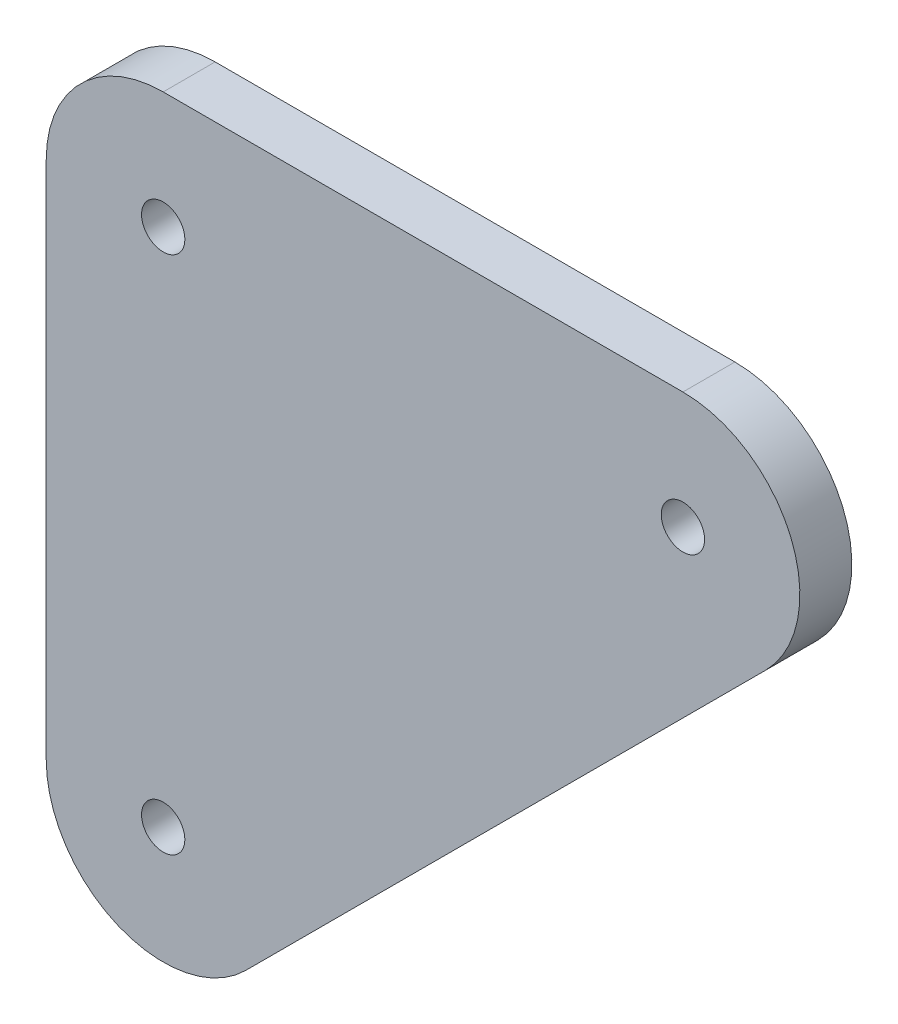
ISO-10303-21;
HEADER;
FILE_DESCRIPTION(('STEP AP214'),'2;1');
FILE_NAME('part.step','',(''),(''),'','','');
FILE_SCHEMA(('AUTOMOTIVE_DESIGN { 1 0 10303 214 1 1 1 1 }'));
ENDSEC;
DATA;
#1=APPLICATION_CONTEXT('core data for automotive mechanical design processes');
#2=APPLICATION_PROTOCOL_DEFINITION('international standard','automotive_design',2000,#1);
#3=PRODUCT_CONTEXT('',#1,'mechanical');
#4=PRODUCT('Part','Part','',(#3));
#5=PRODUCT_RELATED_PRODUCT_CATEGORY('part','',(#4));
#6=PRODUCT_DEFINITION_FORMATION('','',#4);
#7=PRODUCT_DEFINITION_CONTEXT('part definition',#1,'design');
#8=PRODUCT_DEFINITION('design','',#6,#7);
#9=PRODUCT_DEFINITION_SHAPE('','',#8);
#10=(LENGTH_UNIT() NAMED_UNIT(*) SI_UNIT(.MILLI.,.METRE.));
#11=(NAMED_UNIT(*) PLANE_ANGLE_UNIT() SI_UNIT($,.RADIAN.));
#12=(NAMED_UNIT(*) SI_UNIT($,.STERADIAN.) SOLID_ANGLE_UNIT());
#13=UNCERTAINTY_MEASURE_WITH_UNIT(LENGTH_MEASURE(1.E-05),#10,'distance_accuracy_value','');
#14=(GEOMETRIC_REPRESENTATION_CONTEXT(3) GLOBAL_UNCERTAINTY_ASSIGNED_CONTEXT((#13)) GLOBAL_UNIT_ASSIGNED_CONTEXT((#10,
#11,#12)) REPRESENTATION_CONTEXT('',''));
#15=CARTESIAN_POINT('',(0.,0.,0.));
#16=DIRECTION('',(0.,0.,1.));
#17=DIRECTION('',(1.,0.,0.));
#18=AXIS2_PLACEMENT_3D('',#15,#16,#17);
#19=CARTESIAN_POINT('',(-30.,-30.,6.));
#20=DIRECTION('',(0.,0.,1.));
#21=DIRECTION('',(1.,0.,0.));
#22=AXIS2_PLACEMENT_3D('',#19,#20,#21);
#23=PLANE('',#22);
#24=CARTESIAN_POINT('',(-30.,-30.,6.));
#25=DIRECTION('',(0.,0.,1.));
#26=DIRECTION('',(1.,0.,0.));
#27=AXIS2_PLACEMENT_3D('',#24,#25,#26);
#28=CIRCLE('',#27,2.5);
#29=CARTESIAN_POINT('',(-27.5,-30.,6.));
#30=VERTEX_POINT('',#29);
#31=EDGE_CURVE('E184',#30,#30,#28,.T.);
#32=ORIENTED_EDGE('',*,*,#31,.F.);
#33=EDGE_LOOP('',(#32));
#34=FACE_BOUND('',#33,.T.);
#35=CARTESIAN_POINT('',(-30.,-30.,6.));
#36=DIRECTION('',(0.,0.,1.));
#37=DIRECTION('',(1.,0.,0.));
#38=AXIS2_PLACEMENT_3D('',#35,#36,#37);
#39=CIRCLE('',#38,13.5);
#40=CARTESIAN_POINT('',(-43.5,-30.,6.));
#41=VERTEX_POINT('',#40);
#42=CARTESIAN_POINT('',(-20.4540584539816,-39.5459415460184,6.));
#43=VERTEX_POINT('',#42);
#44=EDGE_CURVE('E129',#41,#43,#39,.T.);
#45=ORIENTED_EDGE('',*,*,#44,.T.);
#46=DIRECTION('',(0.707106781186548,0.707106781186547,0.));
#47=VECTOR('',#46,1.);
#48=CARTESIAN_POINT('',(-20.4540584539816,-39.5459415460184,6.));
#49=LINE('',#48,#47);
#50=CARTESIAN_POINT('',(39.5459415460184,20.4540584539816,6.));
#51=VERTEX_POINT('',#50);
#52=EDGE_CURVE('E87',#43,#51,#49,.T.);
#53=ORIENTED_EDGE('',*,*,#52,.T.);
#54=CARTESIAN_POINT('',(30.,30.,6.));
#55=DIRECTION('',(0.,0.,1.));
#56=DIRECTION('',(1.,0.,0.));
#57=AXIS2_PLACEMENT_3D('',#54,#55,#56);
#58=CIRCLE('',#57,13.5);
#59=CARTESIAN_POINT('',(30.,43.5,6.));
#60=VERTEX_POINT('',#59);
#61=EDGE_CURVE('E100',#51,#60,#58,.T.);
#62=ORIENTED_EDGE('',*,*,#61,.T.);
#63=DIRECTION('',(-1.,0.,0.));
#64=VECTOR('',#63,1.);
#65=CARTESIAN_POINT('',(30.,43.5,6.));
#66=LINE('',#65,#64);
#67=CARTESIAN_POINT('',(-30.,43.5,6.));
#68=VERTEX_POINT('',#67);
#69=EDGE_CURVE('E94',#60,#68,#66,.T.);
#70=ORIENTED_EDGE('',*,*,#69,.T.);
#71=CARTESIAN_POINT('',(-30.,30.,6.));
#72=DIRECTION('',(0.,0.,1.));
#73=DIRECTION('',(1.,0.,0.));
#74=AXIS2_PLACEMENT_3D('',#71,#72,#73);
#75=CIRCLE('',#74,13.5);
#76=CARTESIAN_POINT('',(-43.5,30.,6.));
#77=VERTEX_POINT('',#76);
#78=EDGE_CURVE('E98',#68,#77,#75,.T.);
#79=ORIENTED_EDGE('',*,*,#78,.T.);
#80=DIRECTION('',(0.,-1.,0.));
#81=VECTOR('',#80,1.);
#82=CARTESIAN_POINT('',(-43.5,-30.,6.));
#83=LINE('',#82,#81);
#84=EDGE_CURVE('E50',#77,#41,#83,.T.);
#85=ORIENTED_EDGE('',*,*,#84,.T.);
#86=EDGE_LOOP('',(#45,#53,#62,#70,#79,#85));
#87=FACE_BOUND('',#86,.T.);
#88=CARTESIAN_POINT('',(-30.,30.,6.));
#89=DIRECTION('',(0.,0.,1.));
#90=DIRECTION('',(1.,0.,0.));
#91=AXIS2_PLACEMENT_3D('',#88,#89,#90);
#92=CIRCLE('',#91,2.5);
#93=CARTESIAN_POINT('',(-27.5,30.,6.));
#94=VERTEX_POINT('',#93);
#95=EDGE_CURVE('E122',#94,#94,#92,.T.);
#96=ORIENTED_EDGE('',*,*,#95,.F.);
#97=EDGE_LOOP('',(#96));
#98=FACE_BOUND('',#97,.T.);
#99=CARTESIAN_POINT('',(30.,30.,6.));
#100=DIRECTION('',(0.,0.,1.));
#101=DIRECTION('',(1.,0.,0.));
#102=AXIS2_PLACEMENT_3D('',#99,#100,#101);
#103=CIRCLE('',#102,2.5);
#104=CARTESIAN_POINT('',(32.5,30.,6.));
#105=VERTEX_POINT('',#104);
#106=EDGE_CURVE('E175',#105,#105,#103,.T.);
#107=ORIENTED_EDGE('',*,*,#106,.F.);
#108=EDGE_LOOP('',(#107));
#109=FACE_BOUND('',#108,.T.);
#110=ADVANCED_FACE('F33',(#34,#87,#98,#109),#23,.T.);
#111=CARTESIAN_POINT('',(-30.,-30.,0.));
#112=DIRECTION('',(0.,0.,1.));
#113=DIRECTION('',(1.,0.,0.));
#114=AXIS2_PLACEMENT_3D('',#111,#112,#113);
#115=PLANE('',#114);
#116=CARTESIAN_POINT('',(-30.,-30.,0.));
#117=DIRECTION('',(0.,0.,1.));
#118=DIRECTION('',(1.,0.,0.));
#119=AXIS2_PLACEMENT_3D('',#116,#117,#118);
#120=CIRCLE('',#119,13.5);
#121=CARTESIAN_POINT('',(-43.5,-30.,0.));
#122=VERTEX_POINT('',#121);
#123=CARTESIAN_POINT('',(-20.4540584539816,-39.5459415460184,0.));
#124=VERTEX_POINT('',#123);
#125=EDGE_CURVE('E118',#122,#124,#120,.T.);
#126=ORIENTED_EDGE('',*,*,#125,.F.);
#127=DIRECTION('',(0.,-1.,0.));
#128=VECTOR('',#127,1.);
#129=CARTESIAN_POINT('',(-43.5,-30.,0.));
#130=LINE('',#129,#128);
#131=CARTESIAN_POINT('',(-43.5,30.,0.));
#132=VERTEX_POINT('',#131);
#133=EDGE_CURVE('E79',#132,#122,#130,.T.);
#134=ORIENTED_EDGE('',*,*,#133,.F.);
#135=CARTESIAN_POINT('',(-30.,30.,0.));
#136=DIRECTION('',(0.,0.,1.));
#137=DIRECTION('',(1.,0.,0.));
#138=AXIS2_PLACEMENT_3D('',#135,#136,#137);
#139=CIRCLE('',#138,13.5);
#140=CARTESIAN_POINT('',(-30.,43.5,0.));
#141=VERTEX_POINT('',#140);
#142=EDGE_CURVE('E73',#141,#132,#139,.T.);
#143=ORIENTED_EDGE('',*,*,#142,.F.);
#144=DIRECTION('',(-1.,0.,0.));
#145=VECTOR('',#144,1.);
#146=CARTESIAN_POINT('',(30.,43.5,0.));
#147=LINE('',#146,#145);
#148=CARTESIAN_POINT('',(30.,43.5,0.));
#149=VERTEX_POINT('',#148);
#150=EDGE_CURVE('E108',#149,#141,#147,.T.);
#151=ORIENTED_EDGE('',*,*,#150,.F.);
#152=CARTESIAN_POINT('',(30.,30.,0.));
#153=DIRECTION('',(0.,0.,1.));
#154=DIRECTION('',(1.,0.,0.));
#155=AXIS2_PLACEMENT_3D('',#152,#153,#154);
#156=CIRCLE('',#155,13.5);
#157=CARTESIAN_POINT('',(39.5459415460184,20.4540584539816,0.));
#158=VERTEX_POINT('',#157);
#159=EDGE_CURVE('E124',#158,#149,#156,.T.);
#160=ORIENTED_EDGE('',*,*,#159,.F.);
#161=DIRECTION('',(0.707106781186548,0.707106781186547,0.));
#162=VECTOR('',#161,1.);
#163=CARTESIAN_POINT('',(-20.4540584539816,-39.5459415460184,0.));
#164=LINE('',#163,#162);
#165=EDGE_CURVE('E121',#124,#158,#164,.T.);
#166=ORIENTED_EDGE('',*,*,#165,.F.);
#167=EDGE_LOOP('',(#126,#134,#143,#151,#160,#166));
#168=FACE_BOUND('',#167,.T.);
#169=CARTESIAN_POINT('',(-30.,30.,0.));
#170=DIRECTION('',(0.,0.,1.));
#171=DIRECTION('',(1.,0.,0.));
#172=AXIS2_PLACEMENT_3D('',#169,#170,#171);
#173=CIRCLE('',#172,2.5);
#174=CARTESIAN_POINT('',(-27.5,30.,0.));
#175=VERTEX_POINT('',#174);
#176=EDGE_CURVE('E187',#175,#175,#173,.T.);
#177=ORIENTED_EDGE('',*,*,#176,.T.);
#178=EDGE_LOOP('',(#177));
#179=FACE_BOUND('',#178,.T.);
#180=CARTESIAN_POINT('',(-30.,-30.,0.));
#181=DIRECTION('',(0.,0.,1.));
#182=DIRECTION('',(1.,0.,0.));
#183=AXIS2_PLACEMENT_3D('',#180,#181,#182);
#184=CIRCLE('',#183,2.5);
#185=CARTESIAN_POINT('',(-27.5,-30.,0.));
#186=VERTEX_POINT('',#185);
#187=EDGE_CURVE('E181',#186,#186,#184,.T.);
#188=ORIENTED_EDGE('',*,*,#187,.T.);
#189=EDGE_LOOP('',(#188));
#190=FACE_BOUND('',#189,.T.);
#191=CARTESIAN_POINT('',(30.,30.,0.));
#192=DIRECTION('',(0.,0.,1.));
#193=DIRECTION('',(1.,0.,0.));
#194=AXIS2_PLACEMENT_3D('',#191,#192,#193);
#195=CIRCLE('',#194,2.5);
#196=CARTESIAN_POINT('',(32.5,30.,0.));
#197=VERTEX_POINT('',#196);
#198=EDGE_CURVE('E178',#197,#197,#195,.T.);
#199=ORIENTED_EDGE('',*,*,#198,.T.);
#200=EDGE_LOOP('',(#199));
#201=FACE_BOUND('',#200,.T.);
#202=ADVANCED_FACE('F138',(#168,#179,#190,#201),#115,.F.);
#203=CARTESIAN_POINT('',(-30.,-30.,6.));
#204=DIRECTION('',(0.,0.,-1.));
#205=DIRECTION('',(-1.,0.,0.));
#206=AXIS2_PLACEMENT_3D('',#203,#204,#205);
#207=CYLINDRICAL_SURFACE('',#206,13.5);
#208=ORIENTED_EDGE('',*,*,#125,.T.);
#209=DIRECTION('',(0.,0.,-1.));
#210=VECTOR('',#209,1.);
#211=CARTESIAN_POINT('',(-20.4540584539816,-39.5459415460184,6.));
#212=LINE('',#211,#210);
#213=EDGE_CURVE('E11',#43,#124,#212,.T.);
#214=ORIENTED_EDGE('',*,*,#213,.F.);
#215=ORIENTED_EDGE('',*,*,#44,.F.);
#216=DIRECTION('',(0.,0.,-1.));
#217=VECTOR('',#216,1.);
#218=CARTESIAN_POINT('',(-43.5,-30.,6.));
#219=LINE('',#218,#217);
#220=EDGE_CURVE('E114',#41,#122,#219,.T.);
#221=ORIENTED_EDGE('',*,*,#220,.T.);
#222=EDGE_LOOP('',(#208,#214,#215,#221));
#223=FACE_BOUND('',#222,.T.);
#224=ADVANCED_FACE('F35',(#223),#207,.T.);
#225=CARTESIAN_POINT('',(-20.4540584539816,-39.5459415460184,6.));
#226=DIRECTION('',(-0.707106781186547,0.707106781186548,0.));
#227=DIRECTION('',(-0.707106781186548,-0.707106781186547,0.));
#228=AXIS2_PLACEMENT_3D('',#225,#226,#227);
#229=PLANE('',#228);
#230=ORIENTED_EDGE('',*,*,#165,.T.);
#231=DIRECTION('',(0.,0.,-1.));
#232=VECTOR('',#231,1.);
#233=CARTESIAN_POINT('',(39.5459415460184,20.4540584539816,6.));
#234=LINE('',#233,#232);
#235=EDGE_CURVE('E42',#51,#158,#234,.T.);
#236=ORIENTED_EDGE('',*,*,#235,.F.);
#237=ORIENTED_EDGE('',*,*,#52,.F.);
#238=ORIENTED_EDGE('',*,*,#213,.T.);
#239=EDGE_LOOP('',(#230,#236,#237,#238));
#240=FACE_BOUND('',#239,.T.);
#241=ADVANCED_FACE('F237',(#240),#229,.F.);
#242=CARTESIAN_POINT('',(30.,30.,6.));
#243=DIRECTION('',(0.,0.,-1.));
#244=DIRECTION('',(-1.,0.,0.));
#245=AXIS2_PLACEMENT_3D('',#242,#243,#244);
#246=CYLINDRICAL_SURFACE('',#245,13.5);
#247=ORIENTED_EDGE('',*,*,#159,.T.);
#248=DIRECTION('',(0.,0.,-1.));
#249=VECTOR('',#248,1.);
#250=CARTESIAN_POINT('',(30.,43.5,6.));
#251=LINE('',#250,#249);
#252=EDGE_CURVE('E109',#60,#149,#251,.T.);
#253=ORIENTED_EDGE('',*,*,#252,.F.);
#254=ORIENTED_EDGE('',*,*,#61,.F.);
#255=ORIENTED_EDGE('',*,*,#235,.T.);
#256=EDGE_LOOP('',(#247,#253,#254,#255));
#257=FACE_BOUND('',#256,.T.);
#258=ADVANCED_FACE('F135',(#257),#246,.T.);
#259=CARTESIAN_POINT('',(30.,43.5,6.));
#260=DIRECTION('',(0.,-1.,0.));
#261=DIRECTION('',(1.,0.,0.));
#262=AXIS2_PLACEMENT_3D('',#259,#260,#261);
#263=PLANE('',#262);
#264=ORIENTED_EDGE('',*,*,#150,.T.);
#265=DIRECTION('',(0.,0.,-1.));
#266=VECTOR('',#265,1.);
#267=CARTESIAN_POINT('',(-30.,43.5,6.));
#268=LINE('',#267,#266);
#269=EDGE_CURVE('E105',#68,#141,#268,.T.);
#270=ORIENTED_EDGE('',*,*,#269,.F.);
#271=ORIENTED_EDGE('',*,*,#69,.F.);
#272=ORIENTED_EDGE('',*,*,#252,.T.);
#273=EDGE_LOOP('',(#264,#270,#271,#272));
#274=FACE_BOUND('',#273,.T.);
#275=ADVANCED_FACE('F106',(#274),#263,.F.);
#276=CARTESIAN_POINT('',(-30.,30.,6.));
#277=DIRECTION('',(0.,0.,-1.));
#278=DIRECTION('',(-1.,0.,0.));
#279=AXIS2_PLACEMENT_3D('',#276,#277,#278);
#280=CYLINDRICAL_SURFACE('',#279,13.5);
#281=ORIENTED_EDGE('',*,*,#142,.T.);
#282=DIRECTION('',(0.,0.,-1.));
#283=VECTOR('',#282,1.);
#284=CARTESIAN_POINT('',(-43.5,30.,6.));
#285=LINE('',#284,#283);
#286=EDGE_CURVE('E110',#77,#132,#285,.T.);
#287=ORIENTED_EDGE('',*,*,#286,.F.);
#288=ORIENTED_EDGE('',*,*,#78,.F.);
#289=ORIENTED_EDGE('',*,*,#269,.T.);
#290=EDGE_LOOP('',(#281,#287,#288,#289));
#291=FACE_BOUND('',#290,.T.);
#292=ADVANCED_FACE('F112',(#291),#280,.T.);
#293=CARTESIAN_POINT('',(-43.5,-30.,6.));
#294=DIRECTION('',(1.,0.,0.));
#295=DIRECTION('',(0.,0.,-1.));
#296=AXIS2_PLACEMENT_3D('',#293,#294,#295);
#297=PLANE('',#296);
#298=ORIENTED_EDGE('',*,*,#133,.T.);
#299=ORIENTED_EDGE('',*,*,#220,.F.);
#300=ORIENTED_EDGE('',*,*,#84,.F.);
#301=ORIENTED_EDGE('',*,*,#286,.T.);
#302=EDGE_LOOP('',(#298,#299,#300,#301));
#303=FACE_BOUND('',#302,.T.);
#304=ADVANCED_FACE('F143',(#303),#297,.F.);
#305=CARTESIAN_POINT('',(-30.,30.,6.));
#306=DIRECTION('',(0.,0.,-1.));
#307=DIRECTION('',(-1.,0.,0.));
#308=AXIS2_PLACEMENT_3D('',#305,#306,#307);
#309=CYLINDRICAL_SURFACE('',#308,2.5);
#310=ORIENTED_EDGE('',*,*,#95,.T.);
#311=EDGE_LOOP('',(#310));
#312=FACE_BOUND('',#311,.T.);
#313=ORIENTED_EDGE('',*,*,#176,.F.);
#314=EDGE_LOOP('',(#313));
#315=FACE_BOUND('',#314,.T.);
#316=ADVANCED_FACE('F145',(#312,#315),#309,.F.);
#317=CARTESIAN_POINT('',(-30.,-30.,6.));
#318=DIRECTION('',(0.,0.,-1.));
#319=DIRECTION('',(-1.,0.,0.));
#320=AXIS2_PLACEMENT_3D('',#317,#318,#319);
#321=CYLINDRICAL_SURFACE('',#320,2.5);
#322=ORIENTED_EDGE('',*,*,#31,.T.);
#323=EDGE_LOOP('',(#322));
#324=FACE_BOUND('',#323,.T.);
#325=ORIENTED_EDGE('',*,*,#187,.F.);
#326=EDGE_LOOP('',(#325));
#327=FACE_BOUND('',#326,.T.);
#328=ADVANCED_FACE('F151',(#324,#327),#321,.F.);
#329=CARTESIAN_POINT('',(30.,30.,6.));
#330=DIRECTION('',(0.,0.,-1.));
#331=DIRECTION('',(-1.,0.,0.));
#332=AXIS2_PLACEMENT_3D('',#329,#330,#331);
#333=CYLINDRICAL_SURFACE('',#332,2.5);
#334=ORIENTED_EDGE('',*,*,#106,.T.);
#335=EDGE_LOOP('',(#334));
#336=FACE_BOUND('',#335,.T.);
#337=ORIENTED_EDGE('',*,*,#198,.F.);
#338=EDGE_LOOP('',(#337));
#339=FACE_BOUND('',#338,.T.);
#340=ADVANCED_FACE('F166',(#336,#339),#333,.F.);
#341=CLOSED_SHELL('',(#110,#202,#224,#241,#258,#275,#292,#304,#316,#328,#340));
#342=MANIFOLD_SOLID_BREP('B2',#341);
#343=ADVANCED_BREP_SHAPE_REPRESENTATION('',(#18,#342),#14);
#344=SHAPE_DEFINITION_REPRESENTATION(#9,#343);
ENDSEC;
END-ISO-10303-21;
